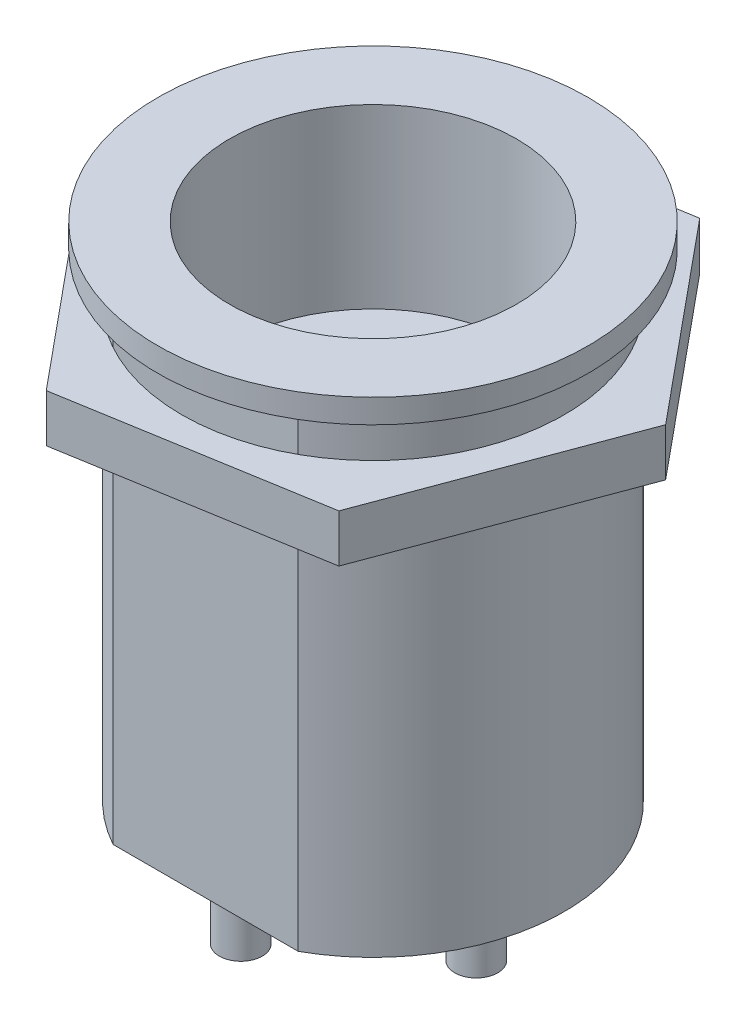
ISO-10303-21;
HEADER;
FILE_DESCRIPTION(('STEP AP214'),'2;1');
FILE_NAME('part.step','',(''),(''),'','','');
FILE_SCHEMA(('AUTOMOTIVE_DESIGN { 1 0 10303 214 1 1 1 1 }'));
ENDSEC;
DATA;
#1=APPLICATION_CONTEXT('core data for automotive mechanical design processes');
#2=APPLICATION_PROTOCOL_DEFINITION('international standard','automotive_design',2000,#1);
#3=PRODUCT_CONTEXT('',#1,'mechanical');
#4=PRODUCT('Part','Part','',(#3));
#5=PRODUCT_RELATED_PRODUCT_CATEGORY('part','',(#4));
#6=PRODUCT_DEFINITION_FORMATION('','',#4);
#7=PRODUCT_DEFINITION_CONTEXT('part definition',#1,'design');
#8=PRODUCT_DEFINITION('design','',#6,#7);
#9=PRODUCT_DEFINITION_SHAPE('','',#8);
#10=(LENGTH_UNIT() NAMED_UNIT(*) SI_UNIT(.MILLI.,.METRE.));
#11=(NAMED_UNIT(*) PLANE_ANGLE_UNIT() SI_UNIT($,.RADIAN.));
#12=(NAMED_UNIT(*) SI_UNIT($,.STERADIAN.) SOLID_ANGLE_UNIT());
#13=UNCERTAINTY_MEASURE_WITH_UNIT(LENGTH_MEASURE(1.E-05),#10,'distance_accuracy_value','');
#14=(GEOMETRIC_REPRESENTATION_CONTEXT(3) GLOBAL_UNCERTAINTY_ASSIGNED_CONTEXT((#13)) GLOBAL_UNIT_ASSIGNED_CONTEXT((#10,
#11,#12)) REPRESENTATION_CONTEXT('',''));
#15=CARTESIAN_POINT('',(0.,0.,0.));
#16=DIRECTION('',(0.,0.,1.));
#17=DIRECTION('',(1.,0.,0.));
#18=AXIS2_PLACEMENT_3D('',#15,#16,#17);
#19=CARTESIAN_POINT('',(6.76572187864048,-5.,8.19250570983917));
#20=DIRECTION('',(0.936985691484807,0.,0.349367734561649));
#21=DIRECTION('',(0.349367734561649,0.,-0.936985691484807));
#22=AXIS2_PLACEMENT_3D('',#19,#20,#21);
#23=PLANE('',#22);
#24=DIRECTION('',(0.349367734561649,0.,-0.936985691484807));
#25=VECTOR('',#24,1.);
#26=CARTESIAN_POINT('',(6.76572187864048,-3.,8.19250570983917));
#27=LINE('',#26,#25);
#28=CARTESIAN_POINT('',(6.76572187864048,-3.,8.19250570983917));
#29=VERTEX_POINT('',#28);
#30=CARTESIAN_POINT('',(10.47777900469,-3.,-1.76303416692324));
#31=VERTEX_POINT('',#30);
#32=EDGE_CURVE('E132',#29,#31,#27,.T.);
#33=ORIENTED_EDGE('',*,*,#32,.F.);
#34=DIRECTION('',(0.,1.,0.));
#35=VECTOR('',#34,1.);
#36=CARTESIAN_POINT('',(6.76572187864048,-5.,8.19250570983917));
#37=LINE('',#36,#35);
#38=CARTESIAN_POINT('',(6.76572187864048,-5.,8.19250570983917));
#39=VERTEX_POINT('',#38);
#40=EDGE_CURVE('E12',#39,#29,#37,.T.);
#41=ORIENTED_EDGE('',*,*,#40,.F.);
#42=DIRECTION('',(0.349367734561649,0.,-0.936985691484807));
#43=VECTOR('',#42,1.);
#44=CARTESIAN_POINT('',(6.76572187864048,-5.,8.19250570983917));
#45=LINE('',#44,#43);
#46=CARTESIAN_POINT('',(10.47777900469,-5.,-1.76303416692324));
#47=VERTEX_POINT('',#46);
#48=EDGE_CURVE('E147',#39,#47,#45,.T.);
#49=ORIENTED_EDGE('',*,*,#48,.T.);
#50=DIRECTION('',(0.,1.,0.));
#51=VECTOR('',#50,1.);
#52=CARTESIAN_POINT('',(10.47777900469,-5.,-1.76303416692324));
#53=LINE('',#52,#51);
#54=EDGE_CURVE('E50',#47,#31,#53,.T.);
#55=ORIENTED_EDGE('',*,*,#54,.T.);
#56=EDGE_LOOP('',(#33,#41,#49,#55));
#57=FACE_BOUND('',#56,.T.);
#58=ADVANCED_FACE('F47',(#57),#23,.T.);
#59=CARTESIAN_POINT('',(-3.71205712604955,-5.,9.95553987676241));
#60=DIRECTION('',(0.165931512349397,0.,0.986137279089196));
#61=DIRECTION('',(0.986137279089196,0.,-0.165931512349397));
#62=AXIS2_PLACEMENT_3D('',#59,#60,#61);
#63=PLANE('',#62);
#64=DIRECTION('',(0.986137279089196,0.,-0.165931512349397));
#65=VECTOR('',#64,1.);
#66=CARTESIAN_POINT('',(-3.71205712604955,-3.,9.95553987676241));
#67=LINE('',#66,#65);
#68=CARTESIAN_POINT('',(-3.71205712604955,-3.,9.95553987676241));
#69=VERTEX_POINT('',#68);
#70=EDGE_CURVE('E145',#69,#29,#67,.T.);
#71=ORIENTED_EDGE('',*,*,#70,.F.);
#72=DIRECTION('',(0.,1.,0.));
#73=VECTOR('',#72,1.);
#74=CARTESIAN_POINT('',(-3.71205712604955,-5.,9.95553987676241));
#75=LINE('',#74,#73);
#76=CARTESIAN_POINT('',(-3.71205712604955,-5.,9.95553987676241));
#77=VERTEX_POINT('',#76);
#78=EDGE_CURVE('E56',#77,#69,#75,.T.);
#79=ORIENTED_EDGE('',*,*,#78,.F.);
#80=DIRECTION('',(0.986137279089196,0.,-0.165931512349397));
#81=VECTOR('',#80,1.);
#82=CARTESIAN_POINT('',(-3.71205712604955,-5.,9.95553987676241));
#83=LINE('',#82,#81);
#84=EDGE_CURVE('E122',#77,#39,#83,.T.);
#85=ORIENTED_EDGE('',*,*,#84,.T.);
#86=ORIENTED_EDGE('',*,*,#40,.T.);
#87=EDGE_LOOP('',(#71,#79,#85,#86));
#88=FACE_BOUND('',#87,.T.);
#89=ADVANCED_FACE('F155',(#88),#63,.T.);
#90=CARTESIAN_POINT('',(-10.47777900469,-5.,1.76303416692325));
#91=DIRECTION('',(-0.77105417913541,0.,0.636769544527547));
#92=DIRECTION('',(0.636769544527547,0.,0.77105417913541));
#93=AXIS2_PLACEMENT_3D('',#90,#91,#92);
#94=PLANE('',#93);
#95=DIRECTION('',(0.636769544527547,0.,0.77105417913541));
#96=VECTOR('',#95,1.);
#97=CARTESIAN_POINT('',(-10.47777900469,-3.,1.76303416692325));
#98=LINE('',#97,#96);
#99=CARTESIAN_POINT('',(-10.47777900469,-3.,1.76303416692325));
#100=VERTEX_POINT('',#99);
#101=EDGE_CURVE('E109',#100,#69,#98,.T.);
#102=ORIENTED_EDGE('',*,*,#101,.F.);
#103=DIRECTION('',(0.,1.,0.));
#104=VECTOR('',#103,1.);
#105=CARTESIAN_POINT('',(-10.47777900469,-5.,1.76303416692325));
#106=LINE('',#105,#104);
#107=CARTESIAN_POINT('',(-10.47777900469,-5.,1.76303416692325));
#108=VERTEX_POINT('',#107);
#109=EDGE_CURVE('E104',#108,#100,#106,.T.);
#110=ORIENTED_EDGE('',*,*,#109,.F.);
#111=DIRECTION('',(0.636769544527547,0.,0.77105417913541));
#112=VECTOR('',#111,1.);
#113=CARTESIAN_POINT('',(-10.47777900469,-5.,1.76303416692325));
#114=LINE('',#113,#112);
#115=EDGE_CURVE('E107',#108,#77,#114,.T.);
#116=ORIENTED_EDGE('',*,*,#115,.T.);
#117=ORIENTED_EDGE('',*,*,#78,.T.);
#118=EDGE_LOOP('',(#102,#110,#116,#117));
#119=FACE_BOUND('',#118,.T.);
#120=ADVANCED_FACE('F106',(#119),#94,.T.);
#121=CARTESIAN_POINT('',(-6.76572187864047,-5.,-8.19250570983917));
#122=DIRECTION('',(-0.936985691484807,0.,-0.349367734561649));
#123=DIRECTION('',(-0.349367734561649,0.,0.936985691484807));
#124=AXIS2_PLACEMENT_3D('',#121,#122,#123);
#125=PLANE('',#124);
#126=DIRECTION('',(-0.349367734561649,0.,0.936985691484807));
#127=VECTOR('',#126,1.);
#128=CARTESIAN_POINT('',(-6.76572187864047,-3.,-8.19250570983917));
#129=LINE('',#128,#127);
#130=CARTESIAN_POINT('',(-6.76572187864047,-3.,-8.19250570983917));
#131=VERTEX_POINT('',#130);
#132=EDGE_CURVE('E142',#131,#100,#129,.T.);
#133=ORIENTED_EDGE('',*,*,#132,.F.);
#134=DIRECTION('',(0.,1.,0.));
#135=VECTOR('',#134,1.);
#136=CARTESIAN_POINT('',(-6.76572187864047,-5.,-8.19250570983917));
#137=LINE('',#136,#135);
#138=CARTESIAN_POINT('',(-6.76572187864047,-5.,-8.19250570983917));
#139=VERTEX_POINT('',#138);
#140=EDGE_CURVE('E114',#139,#131,#137,.T.);
#141=ORIENTED_EDGE('',*,*,#140,.F.);
#142=DIRECTION('',(-0.349367734561649,0.,0.936985691484807));
#143=VECTOR('',#142,1.);
#144=CARTESIAN_POINT('',(-6.76572187864047,-5.,-8.19250570983917));
#145=LINE('',#144,#143);
#146=EDGE_CURVE('E120',#139,#108,#145,.T.);
#147=ORIENTED_EDGE('',*,*,#146,.T.);
#148=ORIENTED_EDGE('',*,*,#109,.T.);
#149=EDGE_LOOP('',(#133,#141,#147,#148));
#150=FACE_BOUND('',#149,.T.);
#151=ADVANCED_FACE('F124',(#150),#125,.T.);
#152=CARTESIAN_POINT('',(3.71205712604955,-5.,-9.95553987676241));
#153=DIRECTION('',(-0.165931512349397,0.,-0.986137279089196));
#154=DIRECTION('',(-0.986137279089196,0.,0.165931512349397));
#155=AXIS2_PLACEMENT_3D('',#152,#153,#154);
#156=PLANE('',#155);
#157=DIRECTION('',(-0.986137279089196,0.,0.165931512349397));
#158=VECTOR('',#157,1.);
#159=CARTESIAN_POINT('',(3.71205712604955,-3.,-9.95553987676241));
#160=LINE('',#159,#158);
#161=CARTESIAN_POINT('',(3.71205712604955,-3.,-9.95553987676241));
#162=VERTEX_POINT('',#161);
#163=EDGE_CURVE('E139',#162,#131,#160,.T.);
#164=ORIENTED_EDGE('',*,*,#163,.F.);
#165=DIRECTION('',(0.,1.,0.));
#166=VECTOR('',#165,1.);
#167=CARTESIAN_POINT('',(3.71205712604955,-5.,-9.95553987676241));
#168=LINE('',#167,#166);
#169=CARTESIAN_POINT('',(3.71205712604955,-5.,-9.95553987676241));
#170=VERTEX_POINT('',#169);
#171=EDGE_CURVE('E150',#170,#162,#168,.T.);
#172=ORIENTED_EDGE('',*,*,#171,.F.);
#173=DIRECTION('',(-0.986137279089196,0.,0.165931512349397));
#174=VECTOR('',#173,1.);
#175=CARTESIAN_POINT('',(3.71205712604955,-5.,-9.95553987676241));
#176=LINE('',#175,#174);
#177=EDGE_CURVE('E125',#170,#139,#176,.T.);
#178=ORIENTED_EDGE('',*,*,#177,.T.);
#179=ORIENTED_EDGE('',*,*,#140,.T.);
#180=EDGE_LOOP('',(#164,#172,#178,#179));
#181=FACE_BOUND('',#180,.T.);
#182=ADVANCED_FACE('F168',(#181),#156,.T.);
#183=CARTESIAN_POINT('',(10.47777900469,-5.,-1.76303416692324));
#184=DIRECTION('',(0.77105417913541,0.,-0.636769544527547));
#185=DIRECTION('',(-0.636769544527547,0.,-0.77105417913541));
#186=AXIS2_PLACEMENT_3D('',#183,#184,#185);
#187=PLANE('',#186);
#188=DIRECTION('',(-0.636769544527547,0.,-0.77105417913541));
#189=VECTOR('',#188,1.);
#190=CARTESIAN_POINT('',(10.47777900469,-3.,-1.76303416692324));
#191=LINE('',#190,#189);
#192=EDGE_CURVE('E135',#31,#162,#191,.T.);
#193=ORIENTED_EDGE('',*,*,#192,.F.);
#194=ORIENTED_EDGE('',*,*,#54,.F.);
#195=DIRECTION('',(-0.636769544527547,0.,-0.77105417913541));
#196=VECTOR('',#195,1.);
#197=CARTESIAN_POINT('',(10.47777900469,-5.,-1.76303416692324));
#198=LINE('',#197,#196);
#199=EDGE_CURVE('E127',#47,#170,#198,.T.);
#200=ORIENTED_EDGE('',*,*,#199,.T.);
#201=ORIENTED_EDGE('',*,*,#171,.T.);
#202=EDGE_LOOP('',(#193,#194,#200,#201));
#203=FACE_BOUND('',#202,.T.);
#204=ADVANCED_FACE('F152',(#203),#187,.T.);
#205=CARTESIAN_POINT('',(0.,-5.,0.));
#206=DIRECTION('',(0.,1.,0.));
#207=DIRECTION('',(0.,0.,1.));
#208=AXIS2_PLACEMENT_3D('',#205,#206,#207);
#209=PLANE('',#208);
#210=CARTESIAN_POINT('',(0.,-5.,0.));
#211=DIRECTION('',(0.,1.,0.));
#212=DIRECTION('',(0.,0.,1.));
#213=AXIS2_PLACEMENT_3D('',#210,#211,#212);
#214=CIRCLE('',#213,8.);
#215=CARTESIAN_POINT('',(0.,-5.,8.));
#216=VERTEX_POINT('',#215);
#217=EDGE_CURVE('E136',#216,#216,#214,.T.);
#218=ORIENTED_EDGE('',*,*,#217,.T.);
#219=EDGE_LOOP('',(#218));
#220=FACE_BOUND('',#219,.T.);
#221=ORIENTED_EDGE('',*,*,#48,.F.);
#222=ORIENTED_EDGE('',*,*,#84,.F.);
#223=ORIENTED_EDGE('',*,*,#115,.F.);
#224=ORIENTED_EDGE('',*,*,#146,.F.);
#225=ORIENTED_EDGE('',*,*,#177,.F.);
#226=ORIENTED_EDGE('',*,*,#199,.F.);
#227=EDGE_LOOP('',(#221,#222,#223,#224,#225,#226));
#228=FACE_BOUND('',#227,.T.);
#229=ADVANCED_FACE('F118',(#220,#228),#209,.F.);
#230=CARTESIAN_POINT('',(0.,-3.,0.));
#231=DIRECTION('',(0.,1.,0.));
#232=DIRECTION('',(0.,0.,1.));
#233=AXIS2_PLACEMENT_3D('',#230,#231,#232);
#234=PLANE('',#233);
#235=CARTESIAN_POINT('',(0.,-3.,0.));
#236=DIRECTION('',(0.,1.,0.));
#237=DIRECTION('',(0.,0.,1.));
#238=AXIS2_PLACEMENT_3D('',#235,#236,#237);
#239=CIRCLE('',#238,8.);
#240=CARTESIAN_POINT('',(0.,-3.,8.));
#241=VERTEX_POINT('',#240);
#242=EDGE_CURVE('E191',#241,#241,#239,.T.);
#243=ORIENTED_EDGE('',*,*,#242,.F.);
#244=EDGE_LOOP('',(#243));
#245=FACE_BOUND('',#244,.T.);
#246=ORIENTED_EDGE('',*,*,#32,.T.);
#247=ORIENTED_EDGE('',*,*,#192,.T.);
#248=ORIENTED_EDGE('',*,*,#163,.T.);
#249=ORIENTED_EDGE('',*,*,#132,.T.);
#250=ORIENTED_EDGE('',*,*,#101,.T.);
#251=ORIENTED_EDGE('',*,*,#70,.T.);
#252=EDGE_LOOP('',(#246,#247,#248,#249,#250,#251));
#253=FACE_BOUND('',#252,.T.);
#254=ADVANCED_FACE('F154',(#245,#253),#234,.T.);
#255=CARTESIAN_POINT('',(0.,-5.,0.));
#256=DIRECTION('',(0.,1.,0.));
#257=DIRECTION('',(0.,0.,1.));
#258=AXIS2_PLACEMENT_3D('',#255,#256,#257);
#259=CYLINDRICAL_SURFACE('',#258,8.);
#260=ORIENTED_EDGE('',*,*,#217,.F.);
#261=EDGE_LOOP('',(#260));
#262=FACE_BOUND('',#261,.T.);
#263=ORIENTED_EDGE('',*,*,#242,.T.);
#264=EDGE_LOOP('',(#263));
#265=FACE_BOUND('',#264,.T.);
#266=ADVANCED_FACE('F179',(#262,#265),#259,.F.);
#267=CLOSED_SHELL('',(#58,#89,#120,#151,#182,#204,#229,#254,#266));
#268=MANIFOLD_SOLID_BREP('B2',#267);
#269=CARTESIAN_POINT('',(0.,0.,0.));
#270=DIRECTION('',(0.,-1.,0.));
#271=DIRECTION('',(0.,0.,-1.));
#272=AXIS2_PLACEMENT_3D('',#269,#270,#271);
#273=CYLINDRICAL_SURFACE('',#272,8.);
#274=DIRECTION('',(0.,-1.,0.));
#275=VECTOR('',#274,1.);
#276=CARTESIAN_POINT('',(-3.87298334620742,0.,7.));
#277=LINE('',#276,#275);
#278=CARTESIAN_POINT('',(-3.87298334620742,-0.999999999999999,7.));
#279=VERTEX_POINT('',#278);
#280=CARTESIAN_POINT('',(-3.87298334620742,-21.,7.));
#281=VERTEX_POINT('',#280);
#282=EDGE_CURVE('E258',#279,#281,#277,.T.);
#283=ORIENTED_EDGE('',*,*,#282,.F.);
#284=CARTESIAN_POINT('',(0.,-0.999999999999999,0.));
#285=DIRECTION('',(0.,-1.,0.));
#286=DIRECTION('',(0.,0.,-1.));
#287=AXIS2_PLACEMENT_3D('',#284,#285,#286);
#288=CIRCLE('',#287,8.);
#289=CARTESIAN_POINT('',(-3.87298334620742,-0.999999999999999,-7.));
#290=VERTEX_POINT('',#289);
#291=EDGE_CURVE('E306',#279,#290,#288,.T.);
#292=ORIENTED_EDGE('',*,*,#291,.T.);
#293=DIRECTION('',(0.,-1.,0.));
#294=VECTOR('',#293,1.);
#295=CARTESIAN_POINT('',(-3.87298334620742,0.,-7.));
#296=LINE('',#295,#294);
#297=CARTESIAN_POINT('',(-3.87298334620742,-21.,-7.));
#298=VERTEX_POINT('',#297);
#299=EDGE_CURVE('E285',#298,#290,#296,.F.);
#300=ORIENTED_EDGE('',*,*,#299,.F.);
#301=CARTESIAN_POINT('',(0.,-21.,0.));
#302=DIRECTION('',(0.,-1.,0.));
#303=DIRECTION('',(0.,0.,-1.));
#304=AXIS2_PLACEMENT_3D('',#301,#302,#303);
#305=CIRCLE('',#304,8.);
#306=EDGE_CURVE('E323',#281,#298,#305,.T.);
#307=ORIENTED_EDGE('',*,*,#306,.F.);
#308=EDGE_LOOP('',(#283,#292,#300,#307));
#309=FACE_BOUND('',#308,.T.);
#310=ADVANCED_FACE('F244',(#309),#273,.T.);
#311=DIRECTION('',(0.,-1.,0.));
#312=VECTOR('',#311,1.);
#313=CARTESIAN_POINT('',(3.87298334620742,0.,7.));
#314=LINE('',#313,#312);
#315=CARTESIAN_POINT('',(3.87298334620742,-21.,7.));
#316=VERTEX_POINT('',#315);
#317=CARTESIAN_POINT('',(3.87298334620742,-0.999999999999999,7.));
#318=VERTEX_POINT('',#317);
#319=EDGE_CURVE('E300',#316,#318,#314,.F.);
#320=ORIENTED_EDGE('',*,*,#319,.F.);
#321=CARTESIAN_POINT('',(3.87298334620742,-21.,-7.));
#322=VERTEX_POINT('',#321);
#323=EDGE_CURVE('E299',#322,#316,#305,.T.);
#324=ORIENTED_EDGE('',*,*,#323,.F.);
#325=DIRECTION('',(0.,-1.,0.));
#326=VECTOR('',#325,1.);
#327=CARTESIAN_POINT('',(3.87298334620742,0.,-7.));
#328=LINE('',#327,#326);
#329=CARTESIAN_POINT('',(3.87298334620742,-0.999999999999999,-7.));
#330=VERTEX_POINT('',#329);
#331=EDGE_CURVE('E266',#330,#322,#328,.T.);
#332=ORIENTED_EDGE('',*,*,#331,.F.);
#333=EDGE_CURVE('E297',#330,#318,#288,.T.);
#334=ORIENTED_EDGE('',*,*,#333,.T.);
#335=EDGE_LOOP('',(#320,#324,#332,#334));
#336=FACE_BOUND('',#335,.T.);
#337=ADVANCED_FACE('F296',(#336),#273,.T.);
#338=CARTESIAN_POINT('',(0.,-21.,0.));
#339=DIRECTION('',(0.,1.,0.));
#340=DIRECTION('',(0.,0.,1.));
#341=AXIS2_PLACEMENT_3D('',#338,#339,#340);
#342=PLANE('',#341);
#343=CARTESIAN_POINT('',(4.92491619142537,-21.,0.604814269122383));
#344=DIRECTION('',(0.,1.,0.));
#345=DIRECTION('',(0.,0.,1.));
#346=AXIS2_PLACEMENT_3D('',#343,#344,#345);
#347=CIRCLE('',#346,0.900373238589789);
#348=CARTESIAN_POINT('',(4.92491619142537,-21.,1.50518750771217));
#349=VERTEX_POINT('',#348);
#350=EDGE_CURVE('E352',#349,#349,#347,.T.);
#351=ORIENTED_EDGE('',*,*,#350,.T.);
#352=EDGE_LOOP('',(#351));
#353=FACE_BOUND('',#352,.T.);
#354=CARTESIAN_POINT('',(-0.604814269122435,-21.,4.92491619142536));
#355=DIRECTION('',(0.,1.,0.));
#356=DIRECTION('',(0.,0.,1.));
#357=AXIS2_PLACEMENT_3D('',#354,#355,#356);
#358=CIRCLE('',#357,0.900373238589789);
#359=CARTESIAN_POINT('',(-0.604814269122435,-21.,5.82528943001515));
#360=VERTEX_POINT('',#359);
#361=EDGE_CURVE('E346',#360,#360,#358,.T.);
#362=ORIENTED_EDGE('',*,*,#361,.T.);
#363=EDGE_LOOP('',(#362));
#364=FACE_BOUND('',#363,.T.);
#365=CARTESIAN_POINT('',(-4.92491619142537,-21.,-0.604814269122418));
#366=DIRECTION('',(0.,1.,0.));
#367=DIRECTION('',(0.,0.,1.));
#368=AXIS2_PLACEMENT_3D('',#365,#366,#367);
#369=CIRCLE('',#368,0.900373238589789);
#370=CARTESIAN_POINT('',(-4.92491619142537,-21.,0.295558969467371));
#371=VERTEX_POINT('',#370);
#372=EDGE_CURVE('E340',#371,#371,#369,.T.);
#373=ORIENTED_EDGE('',*,*,#372,.T.);
#374=EDGE_LOOP('',(#373));
#375=FACE_BOUND('',#374,.T.);
#376=CARTESIAN_POINT('',(0.604814269122435,-21.,-4.92491619142536));
#377=DIRECTION('',(0.,1.,0.));
#378=DIRECTION('',(0.,0.,1.));
#379=AXIS2_PLACEMENT_3D('',#376,#377,#378);
#380=CIRCLE('',#379,0.900373238589789);
#381=CARTESIAN_POINT('',(0.604814269122435,-21.,-4.02454295283558));
#382=VERTEX_POINT('',#381);
#383=EDGE_CURVE('E332',#382,#382,#380,.T.);
#384=ORIENTED_EDGE('',*,*,#383,.T.);
#385=EDGE_LOOP('',(#384));
#386=FACE_BOUND('',#385,.T.);
#387=DIRECTION('',(1.,0.,0.));
#388=VECTOR('',#387,1.);
#389=CARTESIAN_POINT('',(0.,-21.,7.));
#390=LINE('',#389,#388);
#391=EDGE_CURVE('E45',#281,#316,#390,.T.);
#392=ORIENTED_EDGE('',*,*,#391,.F.);
#393=ORIENTED_EDGE('',*,*,#306,.T.);
#394=DIRECTION('',(-1.,0.,0.));
#395=VECTOR('',#394,1.);
#396=CARTESIAN_POINT('',(0.,-21.,-7.));
#397=LINE('',#396,#395);
#398=EDGE_CURVE('E252',#322,#298,#397,.T.);
#399=ORIENTED_EDGE('',*,*,#398,.F.);
#400=ORIENTED_EDGE('',*,*,#323,.T.);
#401=EDGE_LOOP('',(#392,#393,#399,#400));
#402=FACE_BOUND('',#401,.T.);
#403=ADVANCED_FACE('F325',(#353,#364,#375,#386,#402),#342,.F.);
#404=CARTESIAN_POINT('',(0.,0.,0.));
#405=DIRECTION('',(0.,-1.,0.));
#406=DIRECTION('',(0.,0.,-1.));
#407=AXIS2_PLACEMENT_3D('',#404,#405,#406);
#408=CYLINDRICAL_SURFACE('',#407,6.);
#409=CARTESIAN_POINT('',(0.,0.,0.));
#410=DIRECTION('',(0.,-1.,0.));
#411=DIRECTION('',(0.,0.,-1.));
#412=AXIS2_PLACEMENT_3D('',#409,#410,#411);
#413=CIRCLE('',#412,6.);
#414=CARTESIAN_POINT('',(0.,0.,-6.));
#415=VERTEX_POINT('',#414);
#416=EDGE_CURVE('E316',#415,#415,#413,.T.);
#417=ORIENTED_EDGE('',*,*,#416,.F.);
#418=EDGE_LOOP('',(#417));
#419=FACE_BOUND('',#418,.T.);
#420=CARTESIAN_POINT('',(0.,-7.40638749637838,0.));
#421=DIRECTION('',(0.,-1.,0.));
#422=DIRECTION('',(0.,0.,-1.));
#423=AXIS2_PLACEMENT_3D('',#420,#421,#422);
#424=CIRCLE('',#423,6.);
#425=CARTESIAN_POINT('',(0.,-7.40638749637838,-6.));
#426=VERTEX_POINT('',#425);
#427=EDGE_CURVE('E326',#426,#426,#424,.T.);
#428=ORIENTED_EDGE('',*,*,#427,.T.);
#429=EDGE_LOOP('',(#428));
#430=FACE_BOUND('',#429,.T.);
#431=ADVANCED_FACE('F246',(#419,#430),#408,.F.);
#432=CARTESIAN_POINT('',(-9.,0.,0.));
#433=DIRECTION('',(0.,-1.,0.));
#434=DIRECTION('',(0.,0.,-1.));
#435=AXIS2_PLACEMENT_3D('',#432,#433,#434);
#436=PLANE('',#435);
#437=CARTESIAN_POINT('',(0.,0.,0.));
#438=DIRECTION('',(0.,-1.,0.));
#439=DIRECTION('',(0.,0.,-1.));
#440=AXIS2_PLACEMENT_3D('',#437,#438,#439);
#441=CIRCLE('',#440,9.);
#442=CARTESIAN_POINT('',(0.,0.,-9.));
#443=VERTEX_POINT('',#442);
#444=EDGE_CURVE('E309',#443,#443,#441,.T.);
#445=ORIENTED_EDGE('',*,*,#444,.F.);
#446=EDGE_LOOP('',(#445));
#447=FACE_BOUND('',#446,.T.);
#448=ORIENTED_EDGE('',*,*,#416,.T.);
#449=EDGE_LOOP('',(#448));
#450=FACE_BOUND('',#449,.T.);
#451=ADVANCED_FACE('F379',(#447,#450),#436,.F.);
#452=CARTESIAN_POINT('',(0.,0.,0.));
#453=DIRECTION('',(0.,-1.,0.));
#454=DIRECTION('',(0.,0.,-1.));
#455=AXIS2_PLACEMENT_3D('',#452,#453,#454);
#456=CYLINDRICAL_SURFACE('',#455,9.);
#457=CARTESIAN_POINT('',(0.,-1.,0.));
#458=DIRECTION('',(0.,-1.,0.));
#459=DIRECTION('',(0.,0.,-1.));
#460=AXIS2_PLACEMENT_3D('',#457,#458,#459);
#461=CIRCLE('',#460,9.);
#462=CARTESIAN_POINT('',(0.,-1.,-9.));
#463=VERTEX_POINT('',#462);
#464=EDGE_CURVE('E305',#463,#463,#461,.T.);
#465=ORIENTED_EDGE('',*,*,#464,.F.);
#466=EDGE_LOOP('',(#465));
#467=FACE_BOUND('',#466,.T.);
#468=ORIENTED_EDGE('',*,*,#444,.T.);
#469=EDGE_LOOP('',(#468));
#470=FACE_BOUND('',#469,.T.);
#471=ADVANCED_FACE('F377',(#467,#470),#456,.T.);
#472=CARTESIAN_POINT('',(-8.,-0.999999999999999,0.));
#473=DIRECTION('',(0.,1.,0.));
#474=DIRECTION('',(0.,0.,1.));
#475=AXIS2_PLACEMENT_3D('',#472,#473,#474);
#476=PLANE('',#475);
#477=ORIENTED_EDGE('',*,*,#291,.F.);
#478=DIRECTION('',(1.,0.,0.));
#479=VECTOR('',#478,1.);
#480=CARTESIAN_POINT('',(-8.,-0.999999999999999,7.));
#481=LINE('',#480,#479);
#482=EDGE_CURVE('E290',#279,#318,#481,.T.);
#483=ORIENTED_EDGE('',*,*,#482,.T.);
#484=ORIENTED_EDGE('',*,*,#333,.F.);
#485=DIRECTION('',(-1.,0.,0.));
#486=VECTOR('',#485,1.);
#487=CARTESIAN_POINT('',(-8.,-0.999999999999999,-7.));
#488=LINE('',#487,#486);
#489=EDGE_CURVE('E282',#330,#290,#488,.T.);
#490=ORIENTED_EDGE('',*,*,#489,.T.);
#491=EDGE_LOOP('',(#477,#483,#484,#490));
#492=FACE_BOUND('',#491,.T.);
#493=ORIENTED_EDGE('',*,*,#464,.T.);
#494=EDGE_LOOP('',(#493));
#495=FACE_BOUND('',#494,.T.);
#496=ADVANCED_FACE('F303',(#492,#495),#476,.F.);
#497=CARTESIAN_POINT('',(-6.,-7.40638749637838,0.));
#498=DIRECTION('',(0.,-1.,0.));
#499=DIRECTION('',(0.,0.,-1.));
#500=AXIS2_PLACEMENT_3D('',#497,#498,#499);
#501=PLANE('',#500);
#502=ORIENTED_EDGE('',*,*,#427,.F.);
#503=EDGE_LOOP('',(#502));
#504=FACE_BOUND('',#503,.T.);
#505=ADVANCED_FACE('F376',(#504),#501,.F.);
#506=CARTESIAN_POINT('',(0.604814269122435,-49.5466400904229,-4.92491619142536));
#507=DIRECTION('',(0.,1.,0.));
#508=DIRECTION('',(0.,0.,1.));
#509=AXIS2_PLACEMENT_3D('',#506,#507,#508);
#510=CYLINDRICAL_SURFACE('',#509,0.900373238589789);
#511=CARTESIAN_POINT('',(0.604814269122435,-24.,-4.92491619142536));
#512=DIRECTION('',(0.,1.,0.));
#513=DIRECTION('',(0.,0.,1.));
#514=AXIS2_PLACEMENT_3D('',#511,#512,#513);
#515=CIRCLE('',#514,0.900373238589789);
#516=CARTESIAN_POINT('',(0.604814269122435,-24.,-4.02454295283558));
#517=VERTEX_POINT('',#516);
#518=EDGE_CURVE('E328',#517,#517,#515,.F.);
#519=ORIENTED_EDGE('',*,*,#518,.F.);
#520=EDGE_LOOP('',(#519));
#521=FACE_BOUND('',#520,.T.);
#522=ORIENTED_EDGE('',*,*,#383,.F.);
#523=EDGE_LOOP('',(#522));
#524=FACE_BOUND('',#523,.T.);
#525=ADVANCED_FACE('F405',(#521,#524),#510,.T.);
#526=CARTESIAN_POINT('',(-8.,-24.,0.));
#527=DIRECTION('',(0.,1.,0.));
#528=DIRECTION('',(0.,0.,1.));
#529=AXIS2_PLACEMENT_3D('',#526,#527,#528);
#530=PLANE('',#529);
#531=ORIENTED_EDGE('',*,*,#518,.T.);
#532=EDGE_LOOP('',(#531));
#533=FACE_BOUND('',#532,.T.);
#534=ADVANCED_FACE('F407',(#533),#530,.F.);
#535=CARTESIAN_POINT('',(-4.92491619142537,-49.5466400904229,-0.604814269122418));
#536=DIRECTION('',(0.,1.,0.));
#537=DIRECTION('',(0.,0.,1.));
#538=AXIS2_PLACEMENT_3D('',#535,#536,#537);
#539=CYLINDRICAL_SURFACE('',#538,0.900373238589789);
#540=CARTESIAN_POINT('',(-4.92491619142537,-24.,-0.604814269122418));
#541=DIRECTION('',(0.,1.,0.));
#542=DIRECTION('',(0.,0.,1.));
#543=AXIS2_PLACEMENT_3D('',#540,#541,#542);
#544=CIRCLE('',#543,0.900373238589789);
#545=CARTESIAN_POINT('',(-4.92491619142537,-24.,0.295558969467371));
#546=VERTEX_POINT('',#545);
#547=EDGE_CURVE('E337',#546,#546,#544,.F.);
#548=ORIENTED_EDGE('',*,*,#547,.F.);
#549=EDGE_LOOP('',(#548));
#550=FACE_BOUND('',#549,.T.);
#551=ORIENTED_EDGE('',*,*,#372,.F.);
#552=EDGE_LOOP('',(#551));
#553=FACE_BOUND('',#552,.T.);
#554=ADVANCED_FACE('F414',(#550,#553),#539,.T.);
#555=CARTESIAN_POINT('',(-8.,-24.,0.));
#556=DIRECTION('',(0.,1.,0.));
#557=DIRECTION('',(0.,0.,1.));
#558=AXIS2_PLACEMENT_3D('',#555,#556,#557);
#559=PLANE('',#558);
#560=ORIENTED_EDGE('',*,*,#547,.T.);
#561=EDGE_LOOP('',(#560));
#562=FACE_BOUND('',#561,.T.);
#563=ADVANCED_FACE('F422',(#562),#559,.F.);
#564=CARTESIAN_POINT('',(-0.604814269122435,-49.5466400904229,4.92491619142536));
#565=DIRECTION('',(0.,1.,0.));
#566=DIRECTION('',(0.,0.,1.));
#567=AXIS2_PLACEMENT_3D('',#564,#565,#566);
#568=CYLINDRICAL_SURFACE('',#567,0.900373238589789);
#569=CARTESIAN_POINT('',(-0.604814269122435,-24.,4.92491619142536));
#570=DIRECTION('',(0.,1.,0.));
#571=DIRECTION('',(0.,0.,1.));
#572=AXIS2_PLACEMENT_3D('',#569,#570,#571);
#573=CIRCLE('',#572,0.900373238589789);
#574=CARTESIAN_POINT('',(-0.604814269122435,-24.,5.82528943001515));
#575=VERTEX_POINT('',#574);
#576=EDGE_CURVE('E343',#575,#575,#573,.F.);
#577=ORIENTED_EDGE('',*,*,#576,.F.);
#578=EDGE_LOOP('',(#577));
#579=FACE_BOUND('',#578,.T.);
#580=ORIENTED_EDGE('',*,*,#361,.F.);
#581=EDGE_LOOP('',(#580));
#582=FACE_BOUND('',#581,.T.);
#583=ADVANCED_FACE('F426',(#579,#582),#568,.T.);
#584=CARTESIAN_POINT('',(-8.,-24.,0.));
#585=DIRECTION('',(0.,1.,0.));
#586=DIRECTION('',(0.,0.,1.));
#587=AXIS2_PLACEMENT_3D('',#584,#585,#586);
#588=PLANE('',#587);
#589=ORIENTED_EDGE('',*,*,#576,.T.);
#590=EDGE_LOOP('',(#589));
#591=FACE_BOUND('',#590,.T.);
#592=ADVANCED_FACE('F430',(#591),#588,.F.);
#593=CARTESIAN_POINT('',(4.92491619142537,-49.5466400904229,0.604814269122383));
#594=DIRECTION('',(0.,1.,0.));
#595=DIRECTION('',(0.,0.,1.));
#596=AXIS2_PLACEMENT_3D('',#593,#594,#595);
#597=CYLINDRICAL_SURFACE('',#596,0.900373238589789);
#598=CARTESIAN_POINT('',(4.92491619142537,-24.,0.604814269122383));
#599=DIRECTION('',(0.,1.,0.));
#600=DIRECTION('',(0.,0.,1.));
#601=AXIS2_PLACEMENT_3D('',#598,#599,#600);
#602=CIRCLE('',#601,0.900373238589789);
#603=CARTESIAN_POINT('',(4.92491619142537,-24.,1.50518750771217));
#604=VERTEX_POINT('',#603);
#605=EDGE_CURVE('E349',#604,#604,#602,.F.);
#606=ORIENTED_EDGE('',*,*,#605,.F.);
#607=EDGE_LOOP('',(#606));
#608=FACE_BOUND('',#607,.T.);
#609=ORIENTED_EDGE('',*,*,#350,.F.);
#610=EDGE_LOOP('',(#609));
#611=FACE_BOUND('',#610,.T.);
#612=ADVANCED_FACE('F434',(#608,#611),#597,.T.);
#613=CARTESIAN_POINT('',(-8.,-24.,0.));
#614=DIRECTION('',(0.,1.,0.));
#615=DIRECTION('',(0.,0.,1.));
#616=AXIS2_PLACEMENT_3D('',#613,#614,#615);
#617=PLANE('',#616);
#618=ORIENTED_EDGE('',*,*,#605,.T.);
#619=EDGE_LOOP('',(#618));
#620=FACE_BOUND('',#619,.T.);
#621=ADVANCED_FACE('F363',(#620),#617,.F.);
#622=CARTESIAN_POINT('',(-8.,-24.,-7.));
#623=DIRECTION('',(0.,0.,-1.));
#624=DIRECTION('',(-1.,0.,0.));
#625=AXIS2_PLACEMENT_3D('',#622,#623,#624);
#626=PLANE('',#625);
#627=ORIENTED_EDGE('',*,*,#331,.T.);
#628=ORIENTED_EDGE('',*,*,#398,.T.);
#629=ORIENTED_EDGE('',*,*,#299,.T.);
#630=ORIENTED_EDGE('',*,*,#489,.F.);
#631=EDGE_LOOP('',(#627,#628,#629,#630));
#632=FACE_BOUND('',#631,.T.);
#633=ADVANCED_FACE('F283',(#632),#626,.T.);
#634=CARTESIAN_POINT('',(-8.,-24.,7.));
#635=DIRECTION('',(0.,0.,1.));
#636=DIRECTION('',(1.,0.,0.));
#637=AXIS2_PLACEMENT_3D('',#634,#635,#636);
#638=PLANE('',#637);
#639=ORIENTED_EDGE('',*,*,#282,.T.);
#640=ORIENTED_EDGE('',*,*,#391,.T.);
#641=ORIENTED_EDGE('',*,*,#319,.T.);
#642=ORIENTED_EDGE('',*,*,#482,.F.);
#643=EDGE_LOOP('',(#639,#640,#641,#642));
#644=FACE_BOUND('',#643,.T.);
#645=ADVANCED_FACE('F357',(#644),#638,.T.);
#646=CLOSED_SHELL('',(#310,#337,#403,#431,#451,#471,#496,#505,#525,#534,#554,#563,#583,#592,
#612,#621,#633,#645));
#647=MANIFOLD_SOLID_BREP('B6',#646);
#648=ADVANCED_BREP_SHAPE_REPRESENTATION('',(#18,#268,#647),#14);
#649=SHAPE_DEFINITION_REPRESENTATION(#9,#648);
ENDSEC;
END-ISO-10303-21;
